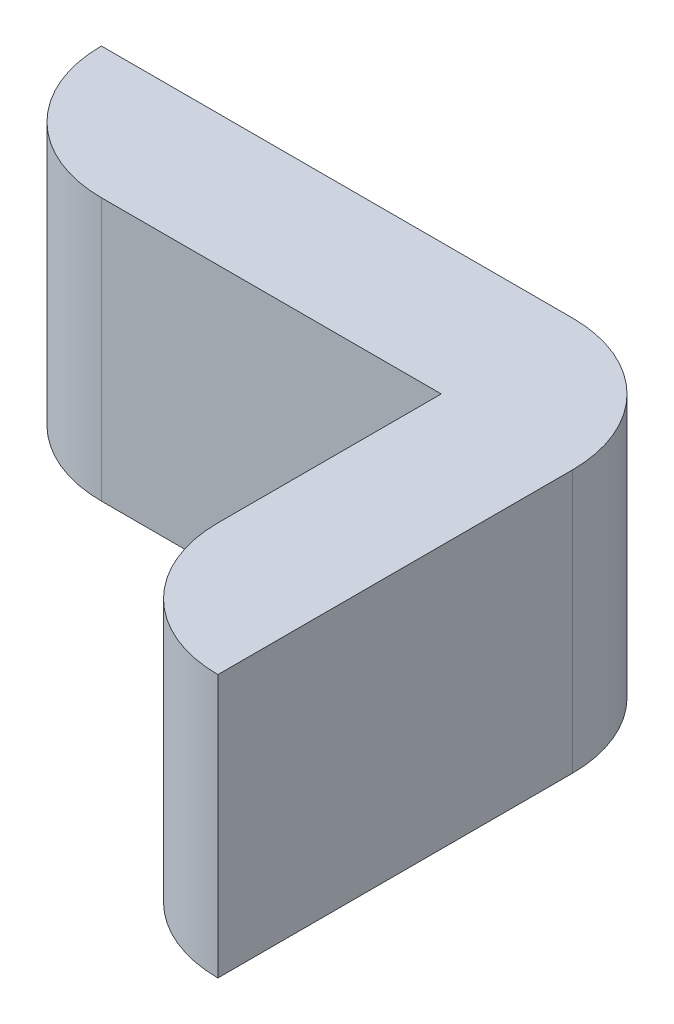
ISO-10303-21;
HEADER;
FILE_DESCRIPTION(('STEP AP214'),'2;1');
FILE_NAME('part.step','',(''),(''),'','','');
FILE_SCHEMA(('AUTOMOTIVE_DESIGN { 1 0 10303 214 1 1 1 1 }'));
ENDSEC;
DATA;
#1=APPLICATION_CONTEXT('core data for automotive mechanical design processes');
#2=APPLICATION_PROTOCOL_DEFINITION('international standard','automotive_design',2000,#1);
#3=PRODUCT_CONTEXT('',#1,'mechanical');
#4=PRODUCT('Part','Part','',(#3));
#5=PRODUCT_RELATED_PRODUCT_CATEGORY('part','',(#4));
#6=PRODUCT_DEFINITION_FORMATION('','',#4);
#7=PRODUCT_DEFINITION_CONTEXT('part definition',#1,'design');
#8=PRODUCT_DEFINITION('design','',#6,#7);
#9=PRODUCT_DEFINITION_SHAPE('','',#8);
#10=(LENGTH_UNIT() NAMED_UNIT(*) SI_UNIT(.MILLI.,.METRE.));
#11=(NAMED_UNIT(*) PLANE_ANGLE_UNIT() SI_UNIT($,.RADIAN.));
#12=(NAMED_UNIT(*) SI_UNIT($,.STERADIAN.) SOLID_ANGLE_UNIT());
#13=UNCERTAINTY_MEASURE_WITH_UNIT(LENGTH_MEASURE(1.E-05),#10,'distance_accuracy_value','');
#14=(GEOMETRIC_REPRESENTATION_CONTEXT(3) GLOBAL_UNCERTAINTY_ASSIGNED_CONTEXT((#13)) GLOBAL_UNIT_ASSIGNED_CONTEXT((#10,
#11,#12)) REPRESENTATION_CONTEXT('',''));
#15=CARTESIAN_POINT('',(0.,0.,0.));
#16=DIRECTION('',(0.,0.,1.));
#17=DIRECTION('',(1.,0.,0.));
#18=AXIS2_PLACEMENT_3D('',#15,#16,#17);
#19=CARTESIAN_POINT('',(-0.4461588971,1.0414,0.4699));
#20=DIRECTION('',(-1.,0.,0.));
#21=DIRECTION('',(0.,0.,1.));
#22=AXIS2_PLACEMENT_3D('',#19,#20,#21);
#23=PLANE('',#22);
#24=DIRECTION('',(0.,0.,-1.));
#25=VECTOR('',#24,1.);
#26=CARTESIAN_POINT('',(-0.4461588971,1.0414,0.));
#27=LINE('',#26,#25);
#28=CARTESIAN_POINT('',(-0.4461588971,1.0414,0.127));
#29=VERTEX_POINT('',#28);
#30=CARTESIAN_POINT('',(-0.4461588971,1.0414,0.4699));
#31=VERTEX_POINT('',#30);
#32=EDGE_CURVE('E128',#29,#31,#27,.F.);
#33=ORIENTED_EDGE('',*,*,#32,.F.);
#34=DIRECTION('',(0.,-1.,0.));
#35=VECTOR('',#34,1.);
#36=CARTESIAN_POINT('',(-0.4461588971,1.0414,0.127));
#37=LINE('',#36,#35);
#38=CARTESIAN_POINT('',(-0.4461588971,1.2954,0.127));
#39=VERTEX_POINT('',#38);
#40=EDGE_CURVE('E81',#39,#29,#37,.T.);
#41=ORIENTED_EDGE('',*,*,#40,.F.);
#42=DIRECTION('',(0.,0.,-1.));
#43=VECTOR('',#42,1.);
#44=CARTESIAN_POINT('',(-0.4461588971,1.2954,0.));
#45=LINE('',#44,#43);
#46=CARTESIAN_POINT('',(-0.4461588971,1.2954,0.4699));
#47=VERTEX_POINT('',#46);
#48=EDGE_CURVE('E76',#39,#47,#45,.F.);
#49=ORIENTED_EDGE('',*,*,#48,.T.);
#50=DIRECTION('',(0.,-1.,0.));
#51=VECTOR('',#50,1.);
#52=CARTESIAN_POINT('',(-0.4461588971,1.0414,0.4699));
#53=LINE('',#52,#51);
#54=EDGE_CURVE('E122',#31,#47,#53,.F.);
#55=ORIENTED_EDGE('',*,*,#54,.F.);
#56=EDGE_LOOP('',(#33,#41,#49,#55));
#57=FACE_BOUND('',#56,.T.);
#58=ADVANCED_FACE('F16',(#57),#23,.F.);
#59=CARTESIAN_POINT('',(-0.4461588971,1.0414,0.3429));
#60=DIRECTION('',(0.,-1.,0.));
#61=DIRECTION('',(0.,0.,-1.));
#62=AXIS2_PLACEMENT_3D('',#59,#60,#61);
#63=CYLINDRICAL_SURFACE('',#62,0.127);
#64=CARTESIAN_POINT('',(-0.4461588971,1.2954,0.3429));
#65=DIRECTION('',(0.,-1.,0.));
#66=DIRECTION('',(0.,0.,-1.));
#67=AXIS2_PLACEMENT_3D('',#64,#65,#66);
#68=CIRCLE('',#67,0.127);
#69=CARTESIAN_POINT('',(-0.5731588971,1.2954,0.3429));
#70=VERTEX_POINT('',#69);
#71=EDGE_CURVE('E106',#47,#70,#68,.T.);
#72=ORIENTED_EDGE('',*,*,#71,.T.);
#73=DIRECTION('',(0.,1.,0.));
#74=VECTOR('',#73,1.);
#75=CARTESIAN_POINT('',(-0.5731588971,1.0414,0.3429));
#76=LINE('',#75,#74);
#77=CARTESIAN_POINT('',(-0.5731588971,1.0414,0.3429));
#78=VERTEX_POINT('',#77);
#79=EDGE_CURVE('E117',#70,#78,#76,.F.);
#80=ORIENTED_EDGE('',*,*,#79,.T.);
#81=CARTESIAN_POINT('',(-0.4461588971,1.0414,0.3429));
#82=DIRECTION('',(0.,-1.,0.));
#83=DIRECTION('',(0.,0.,-1.));
#84=AXIS2_PLACEMENT_3D('',#81,#82,#83);
#85=CIRCLE('',#84,0.127);
#86=EDGE_CURVE('E125',#31,#78,#85,.T.);
#87=ORIENTED_EDGE('',*,*,#86,.F.);
#88=ORIENTED_EDGE('',*,*,#54,.T.);
#89=EDGE_LOOP('',(#72,#80,#87,#88));
#90=FACE_BOUND('',#89,.T.);
#91=ADVANCED_FACE('F132',(#90),#63,.T.);
#92=CARTESIAN_POINT('',(-0.5731588971,1.0414,0.127));
#93=DIRECTION('',(1.,0.,0.));
#94=DIRECTION('',(0.,0.,-1.));
#95=AXIS2_PLACEMENT_3D('',#92,#93,#94);
#96=PLANE('',#95);
#97=ORIENTED_EDGE('',*,*,#79,.F.);
#98=DIRECTION('',(0.,0.,-1.));
#99=VECTOR('',#98,1.);
#100=CARTESIAN_POINT('',(-0.5731588971,1.2954,0.));
#101=LINE('',#100,#99);
#102=CARTESIAN_POINT('',(-0.5731588971,1.2954,0.127));
#103=VERTEX_POINT('',#102);
#104=EDGE_CURVE('E101',#70,#103,#101,.T.);
#105=ORIENTED_EDGE('',*,*,#104,.T.);
#106=DIRECTION('',(0.,1.,0.));
#107=VECTOR('',#106,1.);
#108=CARTESIAN_POINT('',(-0.5731588971,1.0414,0.127));
#109=LINE('',#108,#107);
#110=CARTESIAN_POINT('',(-0.5731588971,1.0414,0.127));
#111=VERTEX_POINT('',#110);
#112=EDGE_CURVE('E114',#103,#111,#109,.F.);
#113=ORIENTED_EDGE('',*,*,#112,.T.);
#114=DIRECTION('',(0.,0.,-1.));
#115=VECTOR('',#114,1.);
#116=CARTESIAN_POINT('',(-0.5731588971,1.0414,0.));
#117=LINE('',#116,#115);
#118=EDGE_CURVE('E127',#78,#111,#117,.T.);
#119=ORIENTED_EDGE('',*,*,#118,.F.);
#120=EDGE_LOOP('',(#97,#105,#113,#119));
#121=FACE_BOUND('',#120,.T.);
#122=ADVANCED_FACE('F157',(#121),#96,.F.);
#123=CARTESIAN_POINT('',(-0.9017,1.0414,0.127));
#124=DIRECTION('',(0.,0.,-1.));
#125=DIRECTION('',(-1.,0.,0.));
#126=AXIS2_PLACEMENT_3D('',#123,#124,#125);
#127=PLANE('',#126);
#128=ORIENTED_EDGE('',*,*,#112,.F.);
#129=DIRECTION('',(1.,0.,0.));
#130=VECTOR('',#129,1.);
#131=CARTESIAN_POINT('',(-1.0287,1.2954,0.127));
#132=LINE('',#131,#130);
#133=CARTESIAN_POINT('',(-0.9017,1.2954,0.127));
#134=VERTEX_POINT('',#133);
#135=EDGE_CURVE('E97',#103,#134,#132,.F.);
#136=ORIENTED_EDGE('',*,*,#135,.T.);
#137=DIRECTION('',(0.,-1.,0.));
#138=VECTOR('',#137,1.);
#139=CARTESIAN_POINT('',(-0.9017,1.0414,0.127));
#140=LINE('',#139,#138);
#141=CARTESIAN_POINT('',(-0.9017,1.0414,0.127));
#142=VERTEX_POINT('',#141);
#143=EDGE_CURVE('E100',#142,#134,#140,.F.);
#144=ORIENTED_EDGE('',*,*,#143,.F.);
#145=DIRECTION('',(1.,0.,0.));
#146=VECTOR('',#145,1.);
#147=CARTESIAN_POINT('',(-1.0287,1.0414,0.127));
#148=LINE('',#147,#146);
#149=EDGE_CURVE('E93',#111,#142,#148,.F.);
#150=ORIENTED_EDGE('',*,*,#149,.F.);
#151=EDGE_LOOP('',(#128,#136,#144,#150));
#152=FACE_BOUND('',#151,.T.);
#153=ADVANCED_FACE('F155',(#152),#127,.F.);
#154=CARTESIAN_POINT('',(-0.5731588971,1.0414,0.127));
#155=DIRECTION('',(0.,-1.,0.));
#156=DIRECTION('',(0.,0.,-1.));
#157=AXIS2_PLACEMENT_3D('',#154,#155,#156);
#158=CYLINDRICAL_SURFACE('',#157,0.127);
#159=CARTESIAN_POINT('',(-0.5731588971,1.2954,0.127));
#160=DIRECTION('',(0.,-1.,0.));
#161=DIRECTION('',(0.,0.,-1.));
#162=AXIS2_PLACEMENT_3D('',#159,#160,#161);
#163=CIRCLE('',#162,0.127);
#164=CARTESIAN_POINT('',(-0.5731588971,1.2954,0.));
#165=VERTEX_POINT('',#164);
#166=EDGE_CURVE('E19',#165,#39,#163,.T.);
#167=ORIENTED_EDGE('',*,*,#166,.T.);
#168=ORIENTED_EDGE('',*,*,#40,.T.);
#169=CARTESIAN_POINT('',(-0.5731588971,1.0414,0.127));
#170=DIRECTION('',(0.,-1.,0.));
#171=DIRECTION('',(0.,0.,-1.));
#172=AXIS2_PLACEMENT_3D('',#169,#170,#171);
#173=CIRCLE('',#172,0.127);
#174=CARTESIAN_POINT('',(-0.5731588971,1.0414,0.));
#175=VERTEX_POINT('',#174);
#176=EDGE_CURVE('E91',#175,#29,#173,.T.);
#177=ORIENTED_EDGE('',*,*,#176,.F.);
#178=DIRECTION('',(0.,1.,0.));
#179=VECTOR('',#178,1.);
#180=CARTESIAN_POINT('',(-0.5731588971,1.0414,0.));
#181=LINE('',#180,#179);
#182=EDGE_CURVE('E85',#175,#165,#181,.T.);
#183=ORIENTED_EDGE('',*,*,#182,.T.);
#184=EDGE_LOOP('',(#167,#168,#177,#183));
#185=FACE_BOUND('',#184,.T.);
#186=ADVANCED_FACE('F89',(#185),#158,.T.);
#187=CARTESIAN_POINT('',(-1.0287,1.2954,0.));
#188=DIRECTION('',(0.,-1.,0.));
#189=DIRECTION('',(0.,0.,-1.));
#190=AXIS2_PLACEMENT_3D('',#187,#188,#189);
#191=PLANE('',#190);
#192=ORIENTED_EDGE('',*,*,#135,.F.);
#193=ORIENTED_EDGE('',*,*,#104,.F.);
#194=ORIENTED_EDGE('',*,*,#71,.F.);
#195=ORIENTED_EDGE('',*,*,#48,.F.);
#196=ORIENTED_EDGE('',*,*,#166,.F.);
#197=DIRECTION('',(1.,0.,0.));
#198=VECTOR('',#197,1.);
#199=CARTESIAN_POINT('',(-0.5731588971,1.2954,0.));
#200=LINE('',#199,#198);
#201=CARTESIAN_POINT('',(-1.0287,1.2954,0.));
#202=VERTEX_POINT('',#201);
#203=EDGE_CURVE('E73',#165,#202,#200,.F.);
#204=ORIENTED_EDGE('',*,*,#203,.T.);
#205=CARTESIAN_POINT('',(-0.9017,1.2954,0.));
#206=DIRECTION('',(0.,-1.,0.));
#207=DIRECTION('',(0.,0.,-1.));
#208=AXIS2_PLACEMENT_3D('',#205,#206,#207);
#209=CIRCLE('',#208,0.127);
#210=EDGE_CURVE('E113',#134,#202,#209,.T.);
#211=ORIENTED_EDGE('',*,*,#210,.F.);
#212=EDGE_LOOP('',(#192,#193,#194,#195,#196,#204,#211));
#213=FACE_BOUND('',#212,.T.);
#214=ADVANCED_FACE('F71',(#213),#191,.F.);
#215=CARTESIAN_POINT('',(-0.9017,1.0414,0.));
#216=DIRECTION('',(0.,-1.,0.));
#217=DIRECTION('',(0.,0.,-1.));
#218=AXIS2_PLACEMENT_3D('',#215,#216,#217);
#219=CYLINDRICAL_SURFACE('',#218,0.127);
#220=ORIENTED_EDGE('',*,*,#210,.T.);
#221=DIRECTION('',(0.,1.,0.));
#222=VECTOR('',#221,1.);
#223=CARTESIAN_POINT('',(-1.0287,1.0414,0.));
#224=LINE('',#223,#222);
#225=CARTESIAN_POINT('',(-1.0287,1.0414,0.));
#226=VERTEX_POINT('',#225);
#227=EDGE_CURVE('E25',#202,#226,#224,.F.);
#228=ORIENTED_EDGE('',*,*,#227,.T.);
#229=CARTESIAN_POINT('',(-0.9017,1.0414,0.));
#230=DIRECTION('',(0.,-1.,0.));
#231=DIRECTION('',(0.,0.,-1.));
#232=AXIS2_PLACEMENT_3D('',#229,#230,#231);
#233=CIRCLE('',#232,0.127);
#234=EDGE_CURVE('E33',#142,#226,#233,.T.);
#235=ORIENTED_EDGE('',*,*,#234,.F.);
#236=ORIENTED_EDGE('',*,*,#143,.T.);
#237=EDGE_LOOP('',(#220,#228,#235,#236));
#238=FACE_BOUND('',#237,.T.);
#239=ADVANCED_FACE('F140',(#238),#219,.T.);
#240=CARTESIAN_POINT('',(-1.0287,1.0414,0.));
#241=DIRECTION('',(0.,-1.,0.));
#242=DIRECTION('',(0.,0.,-1.));
#243=AXIS2_PLACEMENT_3D('',#240,#241,#242);
#244=PLANE('',#243);
#245=ORIENTED_EDGE('',*,*,#149,.T.);
#246=ORIENTED_EDGE('',*,*,#234,.T.);
#247=DIRECTION('',(1.,0.,0.));
#248=VECTOR('',#247,1.);
#249=CARTESIAN_POINT('',(-0.5731588971,1.0414,0.));
#250=LINE('',#249,#248);
#251=EDGE_CURVE('E10',#226,#175,#250,.T.);
#252=ORIENTED_EDGE('',*,*,#251,.T.);
#253=ORIENTED_EDGE('',*,*,#176,.T.);
#254=ORIENTED_EDGE('',*,*,#32,.T.);
#255=ORIENTED_EDGE('',*,*,#86,.T.);
#256=ORIENTED_EDGE('',*,*,#118,.T.);
#257=EDGE_LOOP('',(#245,#246,#252,#253,#254,#255,#256));
#258=FACE_BOUND('',#257,.T.);
#259=ADVANCED_FACE('F138',(#258),#244,.T.);
#260=CARTESIAN_POINT('',(-0.5731588971,1.0414,0.));
#261=DIRECTION('',(0.,0.,1.));
#262=DIRECTION('',(1.,0.,0.));
#263=AXIS2_PLACEMENT_3D('',#260,#261,#262);
#264=PLANE('',#263);
#265=ORIENTED_EDGE('',*,*,#227,.F.);
#266=ORIENTED_EDGE('',*,*,#203,.F.);
#267=ORIENTED_EDGE('',*,*,#182,.F.);
#268=ORIENTED_EDGE('',*,*,#251,.F.);
#269=EDGE_LOOP('',(#265,#266,#267,#268));
#270=FACE_BOUND('',#269,.T.);
#271=ADVANCED_FACE('F84',(#270),#264,.F.);
#272=CLOSED_SHELL('',(#58,#91,#122,#153,#186,#214,#239,#259,#271));
#273=MANIFOLD_SOLID_BREP('B1',#272);
#274=ADVANCED_BREP_SHAPE_REPRESENTATION('',(#18,#273),#14);
#275=SHAPE_DEFINITION_REPRESENTATION(#9,#274);
ENDSEC;
END-ISO-10303-21;
